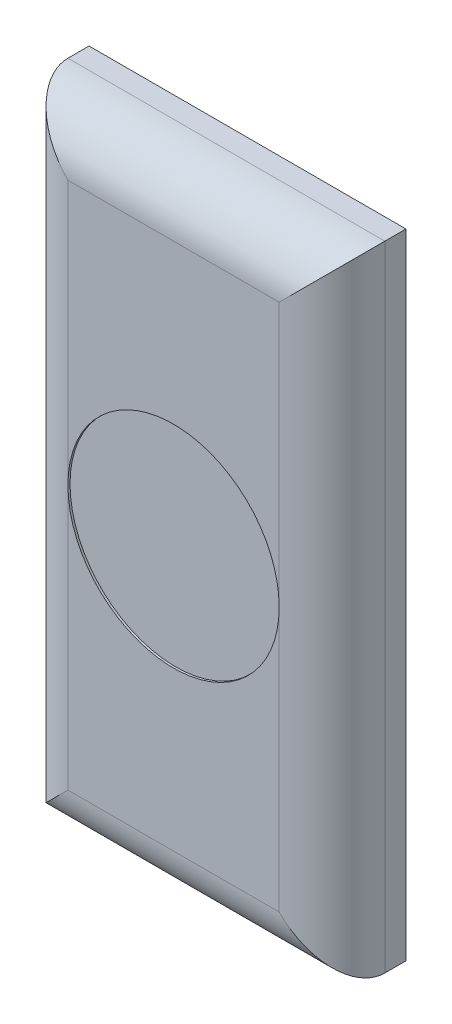
ISO-10303-21;
HEADER;
FILE_DESCRIPTION(('STEP AP214'),'2;1');
FILE_NAME('part.step','',(''),(''),'','','');
FILE_SCHEMA(('AUTOMOTIVE_DESIGN { 1 0 10303 214 1 1 1 1 }'));
ENDSEC;
DATA;
#1=APPLICATION_CONTEXT('core data for automotive mechanical design processes');
#2=APPLICATION_PROTOCOL_DEFINITION('international standard','automotive_design',2000,#1);
#3=PRODUCT_CONTEXT('',#1,'mechanical');
#4=PRODUCT('Part','Part','',(#3));
#5=PRODUCT_RELATED_PRODUCT_CATEGORY('part','',(#4));
#6=PRODUCT_DEFINITION_FORMATION('','',#4);
#7=PRODUCT_DEFINITION_CONTEXT('part definition',#1,'design');
#8=PRODUCT_DEFINITION('design','',#6,#7);
#9=PRODUCT_DEFINITION_SHAPE('','',#8);
#10=(LENGTH_UNIT() NAMED_UNIT(*) SI_UNIT(.MILLI.,.METRE.));
#11=(NAMED_UNIT(*) PLANE_ANGLE_UNIT() SI_UNIT($,.RADIAN.));
#12=(NAMED_UNIT(*) SI_UNIT($,.STERADIAN.) SOLID_ANGLE_UNIT());
#13=UNCERTAINTY_MEASURE_WITH_UNIT(LENGTH_MEASURE(1.E-05),#10,'distance_accuracy_value','');
#14=(GEOMETRIC_REPRESENTATION_CONTEXT(3) GLOBAL_UNCERTAINTY_ASSIGNED_CONTEXT((#13)) GLOBAL_UNIT_ASSIGNED_CONTEXT((#10,
#11,#12)) REPRESENTATION_CONTEXT('',''));
#15=CARTESIAN_POINT('',(0.,0.,0.));
#16=DIRECTION('',(0.,0.,1.));
#17=DIRECTION('',(1.,0.,0.));
#18=AXIS2_PLACEMENT_3D('',#15,#16,#17);
#19=CARTESIAN_POINT('',(53.5503896425,-20.07083694663,5.1327));
#20=DIRECTION('',(0.,0.,1.));
#21=DIRECTION('',(-1.,0.,0.));
#22=AXIS2_PLACEMENT_3D('',#19,#20,#21);
#23=CYLINDRICAL_SURFACE('',#22,0.5);
#24=CARTESIAN_POINT('',(53.55038964251,-20.07083694664,5.13270000001));
#25=DIRECTION('',(0.,0.,1.));
#26=DIRECTION('',(-1.,0.,0.));
#27=AXIS2_PLACEMENT_3D('',#24,#25,#26);
#28=CIRCLE('',#27,0.50000000001);
#29=CARTESIAN_POINT('',(53.0503896425,-20.07083694664,5.13270000001));
#30=VERTEX_POINT('',#29);
#31=EDGE_CURVE('E11',#30,#30,#28,.T.);
#32=ORIENTED_EDGE('',*,*,#31,.F.);
#33=EDGE_LOOP('',(#32));
#34=FACE_BOUND('',#33,.T.);
#35=CARTESIAN_POINT('',(53.55038964251,-20.07083694664,5.14270000001));
#36=DIRECTION('',(0.,0.,-1.));
#37=DIRECTION('',(-1.,0.,0.));
#38=AXIS2_PLACEMENT_3D('',#35,#36,#37);
#39=CIRCLE('',#38,0.50000000001);
#40=CARTESIAN_POINT('',(53.0503896425,-20.07083694663,5.1427));
#41=VERTEX_POINT('',#40);
#42=CARTESIAN_POINT('',(54.0503896425,-20.07083694663,5.1427));
#43=VERTEX_POINT('',#42);
#44=EDGE_CURVE('E28',#41,#43,#39,.T.);
#45=ORIENTED_EDGE('',*,*,#44,.F.);
#46=CARTESIAN_POINT('',(53.55038964251,-20.07083694664,5.14270000001));
#47=DIRECTION('',(0.,0.,-1.));
#48=DIRECTION('',(1.,0.,0.));
#49=AXIS2_PLACEMENT_3D('',#46,#47,#48);
#50=CIRCLE('',#49,0.50000000001);
#51=EDGE_CURVE('E41',#43,#41,#50,.T.);
#52=ORIENTED_EDGE('',*,*,#51,.F.);
#53=EDGE_LOOP('',(#45,#52));
#54=FACE_BOUND('',#53,.T.);
#55=ADVANCED_FACE('F17',(#34,#54),#23,.F.);
#56=CARTESIAN_POINT('',(53.5503896425,-20.07083694663,5.1327));
#57=DIRECTION('',(0.,0.,1.));
#58=DIRECTION('',(1.,0.,0.));
#59=AXIS2_PLACEMENT_3D('',#56,#57,#58);
#60=PLANE('',#59);
#61=ORIENTED_EDGE('',*,*,#31,.T.);
#62=EDGE_LOOP('',(#61));
#63=FACE_BOUND('',#62,.T.);
#64=ADVANCED_FACE('F239',(#63),#60,.T.);
#65=CARTESIAN_POINT('',(54.3003896425,-18.57083694663,5.1427));
#66=DIRECTION('',(0.,0.,1.));
#67=DIRECTION('',(1.,0.,0.));
#68=AXIS2_PLACEMENT_3D('',#65,#66,#67);
#69=PLANE('',#68);
#70=DIRECTION('',(0.,-1.,0.));
#71=VECTOR('',#70,1.);
#72=CARTESIAN_POINT('',(54.05038964251,-18.82083694664,5.14270000001));
#73=LINE('',#72,#71);
#74=CARTESIAN_POINT('',(54.0503896425,-18.82083694663,5.1427));
#75=VERTEX_POINT('',#74);
#76=EDGE_CURVE('E149',#75,#43,#73,.T.);
#77=ORIENTED_EDGE('',*,*,#76,.F.);
#78=DIRECTION('',(1.,0.,0.));
#79=VECTOR('',#78,1.);
#80=CARTESIAN_POINT('',(53.05038964251,-18.82083694664,5.14270000001));
#81=LINE('',#80,#79);
#82=CARTESIAN_POINT('',(53.0503896425,-18.82083694663,5.1427));
#83=VERTEX_POINT('',#82);
#84=EDGE_CURVE('E93',#83,#75,#81,.T.);
#85=ORIENTED_EDGE('',*,*,#84,.F.);
#86=DIRECTION('',(0.,1.,0.));
#87=VECTOR('',#86,1.);
#88=CARTESIAN_POINT('',(53.05038964251,-20.07083694664,5.14270000001));
#89=LINE('',#88,#87);
#90=EDGE_CURVE('E160',#41,#83,#89,.T.);
#91=ORIENTED_EDGE('',*,*,#90,.F.);
#92=ORIENTED_EDGE('',*,*,#44,.T.);
#93=EDGE_LOOP('',(#77,#85,#91,#92));
#94=FACE_BOUND('',#93,.T.);
#95=ADVANCED_FACE('F250',(#94),#69,.T.);
#96=CARTESIAN_POINT('',(53.0503896425,-18.57083694663,4.8927));
#97=DIRECTION('',(0.,1.,0.));
#98=DIRECTION('',(1.,0.,0.));
#99=AXIS2_PLACEMENT_3D('',#96,#97,#98);
#100=CYLINDRICAL_SURFACE('',#99,0.25);
#101=DIRECTION('',(0.,-1.,0.));
#102=VECTOR('',#101,1.);
#103=CARTESIAN_POINT('',(52.80038964251,-18.57083694664,4.89270000001));
#104=LINE('',#103,#102);
#105=CARTESIAN_POINT('',(52.8003896425,-18.57083694663,4.8927));
#106=VERTEX_POINT('',#105);
#107=CARTESIAN_POINT('',(52.8003896425,-21.57083694663,4.8927));
#108=VERTEX_POINT('',#107);
#109=EDGE_CURVE('E121',#106,#108,#104,.T.);
#110=ORIENTED_EDGE('',*,*,#109,.T.);
#111=CARTESIAN_POINT('',(52.80038964251,-21.57083694664,4.89270000001));
#112=CARTESIAN_POINT('',(52.80038964251,-21.57083694664,4.899271280456));
#113=CARTESIAN_POINT('',(52.80090951032,-21.57031707883,4.912469631122));
#114=CARTESIAN_POINT('',(52.8032650871,-21.56796150205,4.932236481749));
#115=CARTESIAN_POINT('',(52.80725368454,-21.56397290461,4.952061485575));
#116=CARTESIAN_POINT('',(52.81296048697,-21.55826610217,4.971901167335));
#117=CARTESIAN_POINT('',(52.82049987698,-21.55072671217,4.991722458162));
#118=CARTESIAN_POINT('',(52.83002930168,-21.54119728747,5.01147208466));
#119=CARTESIAN_POINT('',(52.84166760397,-21.52955898518,5.030951214668));
#120=CARTESIAN_POINT('',(52.85560765235,-21.51561893679,5.050033294403));
#121=CARTESIAN_POINT('',(52.87199124112,-21.49923534803,5.068441992566));
#122=CARTESIAN_POINT('',(52.89094547031,-21.48028111884,5.085850653281));
#123=CARTESIAN_POINT('',(52.9124561125,-21.45877047664,5.101799449564));
#124=CARTESIAN_POINT('',(52.93646249257,-21.43476409657,5.115829084576));
#125=CARTESIAN_POINT('',(52.96270227951,-21.40852430964,5.12741879691));
#126=CARTESIAN_POINT('',(52.99084806313,-21.38037852601,5.136112142431));
#127=CARTESIAN_POINT('',(53.02026926456,-21.35095732459,5.141481380027));
#128=CARTESIAN_POINT('',(53.04028846397,-21.33093812518,5.14270000001));
#129=CARTESIAN_POINT('',(53.05038964251,-21.32083694664,5.14270000001));
#130=B_SPLINE_CURVE_WITH_KNOTS('',3,(#111,#112,#113,#114,#115,#116,#117,#118,#119,#120,#121,
#122,#123,#124,#125,#126,#127,#128,#129),.UNSPECIFIED.,.F.,.F.,(4,1,1,1,1,1,1,1,1,1,1,1,1,1,1,1,
4),(0.,0.0625,0.125,0.1875,0.25,0.3125,0.375,0.4375,0.5,0.5625,0.625,0.6875,0.75,0.8125,0.875,
0.9375,1.),.UNSPECIFIED.);
#131=CARTESIAN_POINT('',(53.0503896425,-21.32083694663,5.1427));
#132=VERTEX_POINT('',#131);
#133=EDGE_CURVE('E114',#108,#132,#130,.T.);
#134=ORIENTED_EDGE('',*,*,#133,.T.);
#135=DIRECTION('',(0.,1.,0.));
#136=VECTOR('',#135,1.);
#137=CARTESIAN_POINT('',(53.05038964251,-21.32083694664,5.14270000001));
#138=LINE('',#137,#136);
#139=EDGE_CURVE('E122',#132,#41,#138,.T.);
#140=ORIENTED_EDGE('',*,*,#139,.T.);
#141=ORIENTED_EDGE('',*,*,#90,.T.);
#142=CARTESIAN_POINT('',(52.80038964251,-18.57083694664,4.89270000001));
#143=CARTESIAN_POINT('',(52.80038964251,-18.57083694664,4.899271280456));
#144=CARTESIAN_POINT('',(52.80090951032,-18.57135681445,4.912469631122));
#145=CARTESIAN_POINT('',(52.8032650871,-18.57371239123,4.932236481749));
#146=CARTESIAN_POINT('',(52.80725368454,-18.57770098867,4.952061485575));
#147=CARTESIAN_POINT('',(52.81296048697,-18.58340779111,4.971901167335));
#148=CARTESIAN_POINT('',(52.82049987698,-18.59094718111,4.991722458162));
#149=CARTESIAN_POINT('',(52.83002930168,-18.60047660581,5.01147208466));
#150=CARTESIAN_POINT('',(52.84166760397,-18.6121149081,5.030951214668));
#151=CARTESIAN_POINT('',(52.85560765235,-18.62605495649,5.050033294403));
#152=CARTESIAN_POINT('',(52.87199124112,-18.64243854525,5.068441992566));
#153=CARTESIAN_POINT('',(52.89094547031,-18.66139277444,5.085850653281));
#154=CARTESIAN_POINT('',(52.9124561125,-18.68290341663,5.101799449564));
#155=CARTESIAN_POINT('',(52.93646249257,-18.7069097967,5.115829084576));
#156=CARTESIAN_POINT('',(52.96270227951,-18.73314958364,5.12741879691));
#157=CARTESIAN_POINT('',(52.99084806313,-18.76129536727,5.136112142431));
#158=CARTESIAN_POINT('',(53.02026926456,-18.79071656869,5.141481380027));
#159=CARTESIAN_POINT('',(53.04028846397,-18.8107357681,5.14270000001));
#160=CARTESIAN_POINT('',(53.05038964251,-18.82083694664,5.14270000001));
#161=B_SPLINE_CURVE_WITH_KNOTS('',3,(#142,#143,#144,#145,#146,#147,#148,#149,#150,#151,#152,
#153,#154,#155,#156,#157,#158,#159,#160),.UNSPECIFIED.,.F.,.F.,(4,1,1,1,1,1,1,1,1,1,1,1,1,1,1,1,
4),(0.,0.0625,0.125,0.1875,0.25,0.3125,0.375,0.4375,0.5,0.5625,0.625,0.6875,0.75,0.8125,0.875,
0.9375,1.),.UNSPECIFIED.);
#162=EDGE_CURVE('E128',#106,#83,#161,.T.);
#163=ORIENTED_EDGE('',*,*,#162,.F.);
#164=EDGE_LOOP('',(#110,#134,#140,#141,#163));
#165=FACE_BOUND('',#164,.T.);
#166=ADVANCED_FACE('F126',(#165),#100,.T.);
#167=CARTESIAN_POINT('',(54.3003896425,-18.82083694663,4.8927));
#168=DIRECTION('',(1.,0.,0.));
#169=DIRECTION('',(0.,-1.,0.));
#170=AXIS2_PLACEMENT_3D('',#167,#168,#169);
#171=CYLINDRICAL_SURFACE('',#170,0.25);
#172=DIRECTION('',(-1.,0.,0.));
#173=VECTOR('',#172,1.);
#174=CARTESIAN_POINT('',(54.30038964251,-18.57083694664,4.89270000001));
#175=LINE('',#174,#173);
#176=CARTESIAN_POINT('',(54.3003896425,-18.57083694663,4.8927));
#177=VERTEX_POINT('',#176);
#178=EDGE_CURVE('E158',#177,#106,#175,.T.);
#179=ORIENTED_EDGE('',*,*,#178,.T.);
#180=ORIENTED_EDGE('',*,*,#162,.T.);
#181=ORIENTED_EDGE('',*,*,#84,.T.);
#182=CARTESIAN_POINT('',(54.30038964251,-18.57083694664,4.89270000001));
#183=CARTESIAN_POINT('',(54.30038964251,-18.57083694664,4.899271280456));
#184=CARTESIAN_POINT('',(54.29986977469,-18.57135681445,4.912469631122));
#185=CARTESIAN_POINT('',(54.29751419791,-18.57371239123,4.932236481749));
#186=CARTESIAN_POINT('',(54.29352560047,-18.57770098867,4.952061485575));
#187=CARTESIAN_POINT('',(54.28781879804,-18.58340779111,4.971901167335));
#188=CARTESIAN_POINT('',(54.28027940803,-18.59094718111,4.991722458162));
#189=CARTESIAN_POINT('',(54.27074998333,-18.60047660581,5.01147208466));
#190=CARTESIAN_POINT('',(54.25911168105,-18.6121149081,5.030951214668));
#191=CARTESIAN_POINT('',(54.24517163266,-18.62605495649,5.050033294403));
#192=CARTESIAN_POINT('',(54.22878804389,-18.64243854525,5.068441992566));
#193=CARTESIAN_POINT('',(54.2098338147,-18.66139277444,5.085850653281));
#194=CARTESIAN_POINT('',(54.18832317251,-18.68290341663,5.101799449564));
#195=CARTESIAN_POINT('',(54.16431679244,-18.7069097967,5.115829084576));
#196=CARTESIAN_POINT('',(54.1380770055,-18.73314958364,5.12741879691));
#197=CARTESIAN_POINT('',(54.10993122188,-18.76129536727,5.136112142431));
#198=CARTESIAN_POINT('',(54.08051002046,-18.79071656869,5.141481380027));
#199=CARTESIAN_POINT('',(54.06049082105,-18.8107357681,5.14270000001));
#200=CARTESIAN_POINT('',(54.05038964251,-18.82083694664,5.14270000001));
#201=B_SPLINE_CURVE_WITH_KNOTS('',3,(#182,#183,#184,#185,#186,#187,#188,#189,#190,#191,#192,
#193,#194,#195,#196,#197,#198,#199,#200),.UNSPECIFIED.,.F.,.F.,(4,1,1,1,1,1,1,1,1,1,1,1,1,1,1,1,
4),(0.,0.0625,0.125,0.1875,0.25,0.3125,0.375,0.4375,0.5,0.5625,0.625,0.6875,0.75,0.8125,0.875,
0.9375,1.),.UNSPECIFIED.);
#202=EDGE_CURVE('E184',#177,#75,#201,.T.);
#203=ORIENTED_EDGE('',*,*,#202,.F.);
#204=EDGE_LOOP('',(#179,#180,#181,#203));
#205=FACE_BOUND('',#204,.T.);
#206=ADVANCED_FACE('F191',(#205),#171,.T.);
#207=CARTESIAN_POINT('',(54.0503896425,-18.57083694663,4.8927));
#208=DIRECTION('',(0.,-1.,0.));
#209=DIRECTION('',(-1.,0.,0.));
#210=AXIS2_PLACEMENT_3D('',#207,#208,#209);
#211=CYLINDRICAL_SURFACE('',#210,0.25);
#212=ORIENTED_EDGE('',*,*,#76,.T.);
#213=DIRECTION('',(0.,-1.,0.));
#214=VECTOR('',#213,1.);
#215=CARTESIAN_POINT('',(54.05038964251,-20.07083694664,5.14270000001));
#216=LINE('',#215,#214);
#217=CARTESIAN_POINT('',(54.0503896425,-21.32083694663,5.1427));
#218=VERTEX_POINT('',#217);
#219=EDGE_CURVE('E168',#43,#218,#216,.T.);
#220=ORIENTED_EDGE('',*,*,#219,.T.);
#221=CARTESIAN_POINT('',(54.30038964251,-21.57083694664,4.89270000001));
#222=CARTESIAN_POINT('',(54.30038964251,-21.57083694664,4.899271280456));
#223=CARTESIAN_POINT('',(54.29986977469,-21.57031707883,4.912469631122));
#224=CARTESIAN_POINT('',(54.29751419791,-21.56796150205,4.932236481749));
#225=CARTESIAN_POINT('',(54.29352560047,-21.56397290461,4.952061485575));
#226=CARTESIAN_POINT('',(54.28781879804,-21.55826610217,4.971901167335));
#227=CARTESIAN_POINT('',(54.28027940803,-21.55072671217,4.991722458162));
#228=CARTESIAN_POINT('',(54.27074998333,-21.54119728747,5.01147208466));
#229=CARTESIAN_POINT('',(54.25911168105,-21.52955898518,5.030951214668));
#230=CARTESIAN_POINT('',(54.24517163266,-21.51561893679,5.050033294403));
#231=CARTESIAN_POINT('',(54.22878804389,-21.49923534803,5.068441992566));
#232=CARTESIAN_POINT('',(54.2098338147,-21.48028111884,5.085850653281));
#233=CARTESIAN_POINT('',(54.18832317251,-21.45877047664,5.101799449564));
#234=CARTESIAN_POINT('',(54.16431679244,-21.43476409657,5.115829084576));
#235=CARTESIAN_POINT('',(54.1380770055,-21.40852430964,5.12741879691));
#236=CARTESIAN_POINT('',(54.10993122188,-21.38037852601,5.136112142431));
#237=CARTESIAN_POINT('',(54.08051002046,-21.35095732459,5.141481380027));
#238=CARTESIAN_POINT('',(54.06049082105,-21.33093812518,5.14270000001));
#239=CARTESIAN_POINT('',(54.05038964251,-21.32083694664,5.14270000001));
#240=B_SPLINE_CURVE_WITH_KNOTS('',3,(#221,#222,#223,#224,#225,#226,#227,#228,#229,#230,#231,
#232,#233,#234,#235,#236,#237,#238,#239),.UNSPECIFIED.,.F.,.F.,(4,1,1,1,1,1,1,1,1,1,1,1,1,1,1,1,
4),(0.,0.0625,0.125,0.1875,0.25,0.3125,0.375,0.4375,0.5,0.5625,0.625,0.6875,0.75,0.8125,0.875,
0.9375,1.),.UNSPECIFIED.);
#241=CARTESIAN_POINT('',(54.3003896425,-21.57083694663,4.8927));
#242=VERTEX_POINT('',#241);
#243=EDGE_CURVE('E111',#242,#218,#240,.T.);
#244=ORIENTED_EDGE('',*,*,#243,.F.);
#245=DIRECTION('',(0.,1.,0.));
#246=VECTOR('',#245,1.);
#247=CARTESIAN_POINT('',(54.30038964251,-21.57083694664,4.89270000001));
#248=LINE('',#247,#246);
#249=EDGE_CURVE('E174',#242,#177,#248,.T.);
#250=ORIENTED_EDGE('',*,*,#249,.T.);
#251=ORIENTED_EDGE('',*,*,#202,.T.);
#252=EDGE_LOOP('',(#212,#220,#244,#250,#251));
#253=FACE_BOUND('',#252,.T.);
#254=ADVANCED_FACE('F19',(#253),#211,.T.);
#255=CARTESIAN_POINT('',(54.3003896425,-21.57083694663,9.6927));
#256=DIRECTION('',(-1.,0.,0.));
#257=DIRECTION('',(0.,0.,1.));
#258=AXIS2_PLACEMENT_3D('',#255,#256,#257);
#259=PLANE('',#258);
#260=DIRECTION('',(0.,-1.,0.));
#261=VECTOR('',#260,1.);
#262=CARTESIAN_POINT('',(54.30038964251,-18.57083694664,4.79270000001));
#263=LINE('',#262,#261);
#264=CARTESIAN_POINT('',(54.3003896425,-18.57083694663,4.7927));
#265=VERTEX_POINT('',#264);
#266=CARTESIAN_POINT('',(54.3003896425,-21.57083694663,4.7927));
#267=VERTEX_POINT('',#266);
#268=EDGE_CURVE('E143',#265,#267,#263,.T.);
#269=ORIENTED_EDGE('',*,*,#268,.F.);
#270=DIRECTION('',(0.,-1.00035527126784E-10,1.));
#271=VECTOR('',#270,1.);
#272=CARTESIAN_POINT('',(54.30038964251,-18.57083694664,4.79270000001));
#273=LINE('',#272,#271);
#274=EDGE_CURVE('E141',#265,#177,#273,.T.);
#275=ORIENTED_EDGE('',*,*,#274,.T.);
#276=ORIENTED_EDGE('',*,*,#249,.F.);
#277=DIRECTION('',(0.,-1.00035527126784E-10,1.));
#278=VECTOR('',#277,1.);
#279=CARTESIAN_POINT('',(54.30038964251,-21.57083694664,4.79270000001));
#280=LINE('',#279,#278);
#281=EDGE_CURVE('E106',#267,#242,#280,.T.);
#282=ORIENTED_EDGE('',*,*,#281,.F.);
#283=EDGE_LOOP('',(#269,#275,#276,#282));
#284=FACE_BOUND('',#283,.T.);
#285=ADVANCED_FACE('F217',(#284),#259,.F.);
#286=CARTESIAN_POINT('',(52.8003896425,-21.57083694663,9.6927));
#287=DIRECTION('',(0.,1.,0.));
#288=DIRECTION('',(1.,0.,0.));
#289=AXIS2_PLACEMENT_3D('',#286,#287,#288);
#290=PLANE('',#289);
#291=DIRECTION('',(-1.,0.,0.));
#292=VECTOR('',#291,1.);
#293=CARTESIAN_POINT('',(54.30038964251,-21.57083694664,4.79270000001));
#294=LINE('',#293,#292);
#295=CARTESIAN_POINT('',(52.8003896425,-21.57083694663,4.7927));
#296=VERTEX_POINT('',#295);
#297=EDGE_CURVE('E70',#267,#296,#294,.T.);
#298=ORIENTED_EDGE('',*,*,#297,.F.);
#299=ORIENTED_EDGE('',*,*,#281,.T.);
#300=DIRECTION('',(1.,0.,0.));
#301=VECTOR('',#300,1.);
#302=CARTESIAN_POINT('',(52.80038964251,-21.57083694664,4.89270000001));
#303=LINE('',#302,#301);
#304=EDGE_CURVE('E100',#108,#242,#303,.T.);
#305=ORIENTED_EDGE('',*,*,#304,.F.);
#306=DIRECTION('',(0.,-1.00035527126784E-10,1.));
#307=VECTOR('',#306,1.);
#308=CARTESIAN_POINT('',(52.80038964251,-21.57083694664,4.79270000001));
#309=LINE('',#308,#307);
#310=EDGE_CURVE('E104',#296,#108,#309,.T.);
#311=ORIENTED_EDGE('',*,*,#310,.F.);
#312=EDGE_LOOP('',(#298,#299,#305,#311));
#313=FACE_BOUND('',#312,.T.);
#314=ADVANCED_FACE('F102',(#313),#290,.F.);
#315=CARTESIAN_POINT('',(52.8003896425,-21.57083694663,9.6927));
#316=DIRECTION('',(1.,0.,0.));
#317=DIRECTION('',(0.,1.,0.));
#318=AXIS2_PLACEMENT_3D('',#315,#316,#317);
#319=PLANE('',#318);
#320=DIRECTION('',(0.,1.,0.));
#321=VECTOR('',#320,1.);
#322=CARTESIAN_POINT('',(52.80038964251,-21.57083694664,4.79270000001));
#323=LINE('',#322,#321);
#324=CARTESIAN_POINT('',(52.8003896425,-18.57083694663,4.7927));
#325=VERTEX_POINT('',#324);
#326=EDGE_CURVE('E62',#296,#325,#323,.T.);
#327=ORIENTED_EDGE('',*,*,#326,.F.);
#328=ORIENTED_EDGE('',*,*,#310,.T.);
#329=ORIENTED_EDGE('',*,*,#109,.F.);
#330=DIRECTION('',(0.,-1.00035527126784E-10,1.));
#331=VECTOR('',#330,1.);
#332=CARTESIAN_POINT('',(52.80038964251,-18.57083694664,4.79270000001));
#333=LINE('',#332,#331);
#334=EDGE_CURVE('E136',#325,#106,#333,.T.);
#335=ORIENTED_EDGE('',*,*,#334,.F.);
#336=EDGE_LOOP('',(#327,#328,#329,#335));
#337=FACE_BOUND('',#336,.T.);
#338=ADVANCED_FACE('F134',(#337),#319,.F.);
#339=CARTESIAN_POINT('',(52.8003896425,-18.57083694663,9.6927));
#340=DIRECTION('',(0.,-1.,0.));
#341=DIRECTION('',(0.,0.,-1.));
#342=AXIS2_PLACEMENT_3D('',#339,#340,#341);
#343=PLANE('',#342);
#344=DIRECTION('',(1.,0.,0.));
#345=VECTOR('',#344,1.);
#346=CARTESIAN_POINT('',(52.80038964251,-18.57083694664,4.79270000001));
#347=LINE('',#346,#345);
#348=EDGE_CURVE('E110',#325,#265,#347,.T.);
#349=ORIENTED_EDGE('',*,*,#348,.F.);
#350=ORIENTED_EDGE('',*,*,#334,.T.);
#351=ORIENTED_EDGE('',*,*,#178,.F.);
#352=ORIENTED_EDGE('',*,*,#274,.F.);
#353=EDGE_LOOP('',(#349,#350,#351,#352));
#354=FACE_BOUND('',#353,.T.);
#355=ADVANCED_FACE('F220',(#354),#343,.F.);
#356=CARTESIAN_POINT('',(54.3003896425,-18.57083694663,4.7927));
#357=DIRECTION('',(0.,0.,1.));
#358=DIRECTION('',(1.,0.,0.));
#359=AXIS2_PLACEMENT_3D('',#356,#357,#358);
#360=PLANE('',#359);
#361=ORIENTED_EDGE('',*,*,#268,.T.);
#362=ORIENTED_EDGE('',*,*,#297,.T.);
#363=ORIENTED_EDGE('',*,*,#326,.T.);
#364=ORIENTED_EDGE('',*,*,#348,.T.);
#365=EDGE_LOOP('',(#361,#362,#363,#364));
#366=FACE_BOUND('',#365,.T.);
#367=ADVANCED_FACE('F222',(#366),#360,.F.);
#368=CARTESIAN_POINT('',(54.3003896425,-21.32083694663,4.8927));
#369=DIRECTION('',(-1.,0.,0.));
#370=DIRECTION('',(0.,1.,0.));
#371=AXIS2_PLACEMENT_3D('',#368,#369,#370);
#372=CYLINDRICAL_SURFACE('',#371,0.25);
#373=ORIENTED_EDGE('',*,*,#304,.T.);
#374=ORIENTED_EDGE('',*,*,#243,.T.);
#375=DIRECTION('',(-1.,0.,0.));
#376=VECTOR('',#375,1.);
#377=CARTESIAN_POINT('',(54.05038964251,-21.32083694664,5.14270000001));
#378=LINE('',#377,#376);
#379=EDGE_CURVE('E21',#218,#132,#378,.T.);
#380=ORIENTED_EDGE('',*,*,#379,.T.);
#381=ORIENTED_EDGE('',*,*,#133,.F.);
#382=EDGE_LOOP('',(#373,#374,#380,#381));
#383=FACE_BOUND('',#382,.T.);
#384=ADVANCED_FACE('F116',(#383),#372,.T.);
#385=ORIENTED_EDGE('',*,*,#139,.F.);
#386=ORIENTED_EDGE('',*,*,#379,.F.);
#387=ORIENTED_EDGE('',*,*,#219,.F.);
#388=ORIENTED_EDGE('',*,*,#51,.T.);
#389=EDGE_LOOP('',(#385,#386,#387,#388));
#390=FACE_BOUND('',#389,.T.);
#391=ADVANCED_FACE('F261',(#390),#69,.T.);
#392=CLOSED_SHELL('',(#55,#64,#95,#166,#206,#254,#285,#314,#338,#355,#367,#384,#391));
#393=MANIFOLD_SOLID_BREP('B1',#392);
#394=ADVANCED_BREP_SHAPE_REPRESENTATION('',(#18,#393),#14);
#395=SHAPE_DEFINITION_REPRESENTATION(#9,#394);
ENDSEC;
END-ISO-10303-21;
